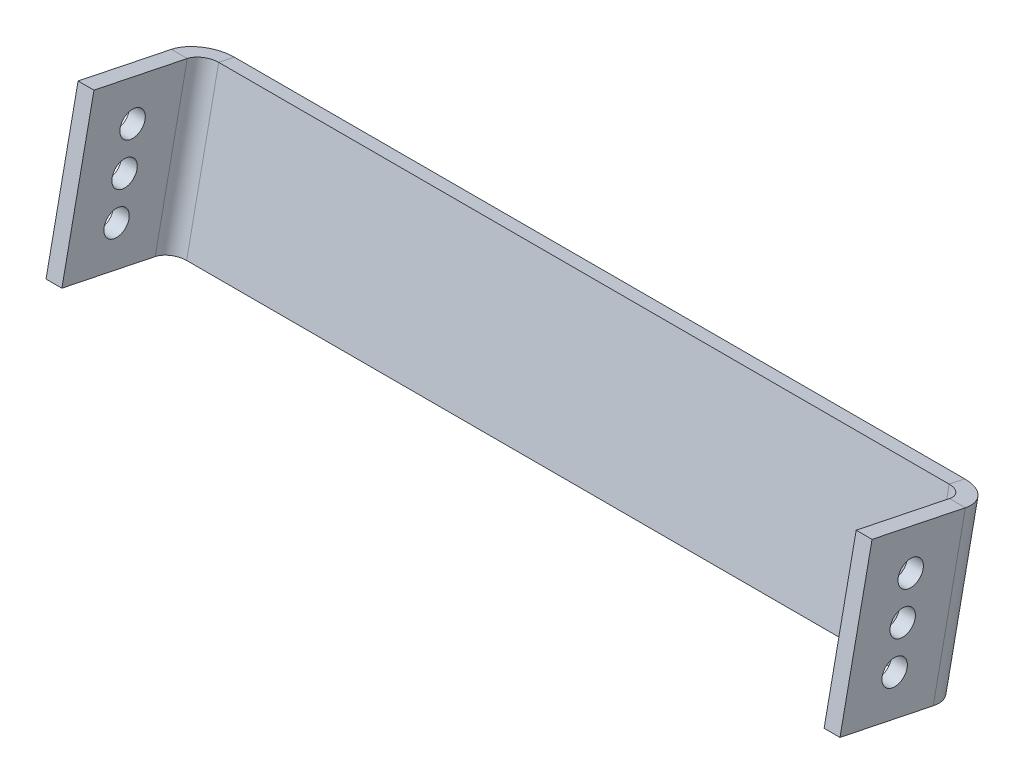
ISO-10303-21;
HEADER;
FILE_DESCRIPTION(('STEP AP214'),'2;1');
FILE_NAME('part.step','',(''),(''),'','','');
FILE_SCHEMA(('AUTOMOTIVE_DESIGN { 1 0 10303 214 1 1 1 1 }'));
ENDSEC;
DATA;
#1=APPLICATION_CONTEXT('core data for automotive mechanical design processes');
#2=APPLICATION_PROTOCOL_DEFINITION('international standard','automotive_design',2000,#1);
#3=PRODUCT_CONTEXT('',#1,'mechanical');
#4=PRODUCT('Part','Part','',(#3));
#5=PRODUCT_RELATED_PRODUCT_CATEGORY('part','',(#4));
#6=PRODUCT_DEFINITION_FORMATION('','',#4);
#7=PRODUCT_DEFINITION_CONTEXT('part definition',#1,'design');
#8=PRODUCT_DEFINITION('design','',#6,#7);
#9=PRODUCT_DEFINITION_SHAPE('','',#8);
#10=(LENGTH_UNIT() NAMED_UNIT(*) SI_UNIT(.MILLI.,.METRE.));
#11=(NAMED_UNIT(*) PLANE_ANGLE_UNIT() SI_UNIT($,.RADIAN.));
#12=(NAMED_UNIT(*) SI_UNIT($,.STERADIAN.) SOLID_ANGLE_UNIT());
#13=UNCERTAINTY_MEASURE_WITH_UNIT(LENGTH_MEASURE(1.E-05),#10,'distance_accuracy_value','');
#14=(GEOMETRIC_REPRESENTATION_CONTEXT(3) GLOBAL_UNCERTAINTY_ASSIGNED_CONTEXT((#13)) GLOBAL_UNIT_ASSIGNED_CONTEXT((#10,
#11,#12)) REPRESENTATION_CONTEXT('',''));
#15=CARTESIAN_POINT('',(0.,0.,0.));
#16=DIRECTION('',(0.,0.,1.));
#17=DIRECTION('',(1.,0.,0.));
#18=AXIS2_PLACEMENT_3D('',#15,#16,#17);
#19=CARTESIAN_POINT('',(158.75,97.3688534477811,-774.725032288376));
#20=DIRECTION('',(0.,0.201971637600388,0.979391371008045));
#21=DIRECTION('',(0.,-0.979391371008045,0.201971637600388));
#22=AXIS2_PLACEMENT_3D('',#19,#20,#21);
#23=PLANE('',#22);
#24=DIRECTION('',(0.,-0.979391371008045,0.201971637600388));
#25=VECTOR('',#24,1.);
#26=CARTESIAN_POINT('',(6.34999999999999,97.3688534477812,-774.725032288376));
#27=LINE('',#26,#25);
#28=CARTESIAN_POINT('',(6.34999999999999,97.3688534477812,-774.725032288376));
#29=VERTEX_POINT('',#28);
#30=CARTESIAN_POINT('',(6.34999999999998,128.464529477287,-781.137631782189));
#31=VERTEX_POINT('',#30);
#32=EDGE_CURVE('E215',#29,#31,#27,.F.);
#33=ORIENTED_EDGE('',*,*,#32,.T.);
#34=DIRECTION('',(-1.,0.,0.));
#35=VECTOR('',#34,1.);
#36=CARTESIAN_POINT('',(158.75,128.464529477287,-781.137631782189));
#37=LINE('',#36,#35);
#38=CARTESIAN_POINT('',(152.4,128.464529477287,-781.137631782189));
#39=VERTEX_POINT('',#38);
#40=EDGE_CURVE('E89',#39,#31,#37,.T.);
#41=ORIENTED_EDGE('',*,*,#40,.F.);
#42=DIRECTION('',(0.,0.979391371008045,-0.201971637600387));
#43=VECTOR('',#42,1.);
#44=CARTESIAN_POINT('',(152.4,128.464529477287,-781.137631782189));
#45=LINE('',#44,#43);
#46=CARTESIAN_POINT('',(152.4,97.3688534477811,-774.725032288376));
#47=VERTEX_POINT('',#46);
#48=EDGE_CURVE('E104',#39,#47,#45,.F.);
#49=ORIENTED_EDGE('',*,*,#48,.T.);
#50=DIRECTION('',(-1.,0.,0.));
#51=VECTOR('',#50,1.);
#52=CARTESIAN_POINT('',(158.75,97.3688534477811,-774.725032288376));
#53=LINE('',#52,#51);
#54=EDGE_CURVE('E13',#47,#29,#53,.T.);
#55=ORIENTED_EDGE('',*,*,#54,.T.);
#56=EDGE_LOOP('',(#33,#41,#49,#55));
#57=FACE_BOUND('',#56,.T.);
#58=ADVANCED_FACE('F80',(#57),#23,.F.);
#59=CARTESIAN_POINT('',(158.75,98.0101133971623,-771.615464685426));
#60=DIRECTION('',(0.,0.201971637600388,0.979391371008045));
#61=DIRECTION('',(0.,-0.979391371008045,0.201971637600388));
#62=AXIS2_PLACEMENT_3D('',#59,#60,#61);
#63=PLANE('',#62);
#64=DIRECTION('',(1.,0.,0.));
#65=VECTOR('',#64,1.);
#66=CARTESIAN_POINT('',(158.75,129.105789426668,-778.028064179238));
#67=LINE('',#66,#65);
#68=CARTESIAN_POINT('',(152.4,129.105789426668,-778.028064179238));
#69=VERTEX_POINT('',#68);
#70=CARTESIAN_POINT('',(6.34999999999998,129.105789426668,-778.028064179238));
#71=VERTEX_POINT('',#70);
#72=EDGE_CURVE('E286',#69,#71,#67,.F.);
#73=ORIENTED_EDGE('',*,*,#72,.T.);
#74=DIRECTION('',(0.,-0.979391371008045,0.201971637600388));
#75=VECTOR('',#74,1.);
#76=CARTESIAN_POINT('',(6.34999999999999,98.0101133971624,-771.615464685426));
#77=LINE('',#76,#75);
#78=CARTESIAN_POINT('',(6.34999999999999,98.0101133971624,-771.615464685426));
#79=VERTEX_POINT('',#78);
#80=EDGE_CURVE('E227',#79,#71,#77,.F.);
#81=ORIENTED_EDGE('',*,*,#80,.F.);
#82=DIRECTION('',(1.,0.,0.));
#83=VECTOR('',#82,1.);
#84=CARTESIAN_POINT('',(158.75,98.0101133971623,-771.615464685426));
#85=LINE('',#84,#83);
#86=CARTESIAN_POINT('',(152.4,98.0101133971623,-771.615464685426));
#87=VERTEX_POINT('',#86);
#88=EDGE_CURVE('E290',#87,#79,#85,.F.);
#89=ORIENTED_EDGE('',*,*,#88,.F.);
#90=DIRECTION('',(0.,0.979391371008045,-0.201971637600387));
#91=VECTOR('',#90,1.);
#92=CARTESIAN_POINT('',(152.4,129.105789426668,-778.028064179238));
#93=LINE('',#92,#91);
#94=EDGE_CURVE('E97',#69,#87,#93,.F.);
#95=ORIENTED_EDGE('',*,*,#94,.F.);
#96=EDGE_LOOP('',(#73,#81,#89,#95));
#97=FACE_BOUND('',#96,.T.);
#98=ADVANCED_FACE('F360',(#97),#63,.T.);
#99=CARTESIAN_POINT('',(158.75,97.3688534477811,-774.725032288376));
#100=DIRECTION('',(0.,0.979391371008045,-0.201971637600388));
#101=DIRECTION('',(-1.,0.,0.));
#102=AXIS2_PLACEMENT_3D('',#99,#100,#101);
#103=PLANE('',#102);
#104=ORIENTED_EDGE('',*,*,#88,.T.);
#105=DIRECTION('',(0.,-0.201971637600388,-0.979391371008045));
#106=VECTOR('',#105,1.);
#107=CARTESIAN_POINT('',(6.34999999999999,98.0101133971624,-771.615464685426));
#108=LINE('',#107,#106);
#109=EDGE_CURVE('E221',#79,#29,#108,.T.);
#110=ORIENTED_EDGE('',*,*,#109,.T.);
#111=ORIENTED_EDGE('',*,*,#54,.F.);
#112=DIRECTION('',(0.,-0.201971637600388,-0.979391371008045));
#113=VECTOR('',#112,1.);
#114=CARTESIAN_POINT('',(152.4,98.0101133971623,-771.615464685426));
#115=LINE('',#114,#113);
#116=EDGE_CURVE('E283',#87,#47,#115,.T.);
#117=ORIENTED_EDGE('',*,*,#116,.F.);
#118=EDGE_LOOP('',(#104,#110,#111,#117));
#119=FACE_BOUND('',#118,.T.);
#120=ADVANCED_FACE('F339',(#119),#103,.F.);
#121=CARTESIAN_POINT('',(158.75,128.464529477287,-781.137631782189));
#122=DIRECTION('',(0.,0.979391371008045,-0.201971637600388));
#123=DIRECTION('',(-1.,0.,0.));
#124=AXIS2_PLACEMENT_3D('',#121,#122,#123);
#125=PLANE('',#124);
#126=DIRECTION('',(0.,-0.201971637600387,-0.979391371008045));
#127=VECTOR('',#126,1.);
#128=CARTESIAN_POINT('',(6.34999999999998,129.105789426668,-778.028064179238));
#129=LINE('',#128,#127);
#130=EDGE_CURVE('E233',#71,#31,#129,.T.);
#131=ORIENTED_EDGE('',*,*,#130,.F.);
#132=ORIENTED_EDGE('',*,*,#72,.F.);
#133=DIRECTION('',(0.,-0.201971637600387,-0.979391371008045));
#134=VECTOR('',#133,1.);
#135=CARTESIAN_POINT('',(152.4,129.105789426668,-778.028064179238));
#136=LINE('',#135,#134);
#137=EDGE_CURVE('E274',#69,#39,#136,.T.);
#138=ORIENTED_EDGE('',*,*,#137,.T.);
#139=ORIENTED_EDGE('',*,*,#40,.T.);
#140=EDGE_LOOP('',(#131,#132,#138,#139));
#141=FACE_BOUND('',#140,.T.);
#142=ADVANCED_FACE('F82',(#141),#125,.T.);
#143=CARTESIAN_POINT('',(152.4,98.6513733465436,-768.505897082475));
#144=DIRECTION('',(0.,-0.979391371008045,0.201971637600387));
#145=DIRECTION('',(0.,-0.201971637600387,-0.979391371008045));
#146=AXIS2_PLACEMENT_3D('',#143,#144,#145);
#147=PLANE('',#146);
#148=DIRECTION('',(-1.,0.,0.));
#149=VECTOR('',#148,1.);
#150=CARTESIAN_POINT('',(158.75,98.6513733465436,-768.505897082475));
#151=LINE('',#150,#149);
#152=CARTESIAN_POINT('',(155.575,98.6513733465436,-768.505897082475));
#153=VERTEX_POINT('',#152);
#154=CARTESIAN_POINT('',(158.75,98.6513733465436,-768.505897082475));
#155=VERTEX_POINT('',#154);
#156=EDGE_CURVE('E236',#153,#155,#151,.F.);
#157=ORIENTED_EDGE('',*,*,#156,.F.);
#158=CARTESIAN_POINT('',(152.4,98.6513733465436,-768.505897082475));
#159=DIRECTION('',(0.,0.979391371008045,-0.201971637600387));
#160=DIRECTION('',(0.,0.201971637600387,0.979391371008045));
#161=AXIS2_PLACEMENT_3D('',#158,#159,#160);
#162=CIRCLE('',#161,3.17500000000001);
#163=EDGE_CURVE('E277',#87,#153,#162,.F.);
#164=ORIENTED_EDGE('',*,*,#163,.F.);
#165=ORIENTED_EDGE('',*,*,#116,.T.);
#166=CARTESIAN_POINT('',(152.4,98.6513733465436,-768.505897082475));
#167=DIRECTION('',(0.,0.979391371008045,-0.201971637600387));
#168=DIRECTION('',(0.,0.201971637600387,0.979391371008045));
#169=AXIS2_PLACEMENT_3D('',#166,#167,#168);
#170=CIRCLE('',#169,6.35000000000001);
#171=EDGE_CURVE('E270',#47,#155,#170,.F.);
#172=ORIENTED_EDGE('',*,*,#171,.T.);
#173=EDGE_LOOP('',(#157,#164,#165,#172));
#174=FACE_BOUND('',#173,.T.);
#175=ADVANCED_FACE('F373',(#174),#147,.T.);
#176=CARTESIAN_POINT('',(152.4,129.747049376049,-774.918496576287));
#177=DIRECTION('',(0.,-0.979391371008045,0.201971637600387));
#178=DIRECTION('',(0.,-0.201971637600387,-0.979391371008045));
#179=AXIS2_PLACEMENT_3D('',#176,#177,#178);
#180=PLANE('',#179);
#181=CARTESIAN_POINT('',(152.4,129.747049376049,-774.918496576287));
#182=DIRECTION('',(0.,0.979391371008045,-0.201971637600387));
#183=DIRECTION('',(0.,0.201971637600387,0.979391371008045));
#184=AXIS2_PLACEMENT_3D('',#181,#182,#183);
#185=CIRCLE('',#184,3.17500000000001);
#186=CARTESIAN_POINT('',(155.575,129.747049376049,-774.918496576287));
#187=VERTEX_POINT('',#186);
#188=EDGE_CURVE('E242',#187,#69,#185,.T.);
#189=ORIENTED_EDGE('',*,*,#188,.F.);
#190=DIRECTION('',(-1.,0.,0.));
#191=VECTOR('',#190,1.);
#192=CARTESIAN_POINT('',(155.575,129.747049376049,-774.918496576287));
#193=LINE('',#192,#191);
#194=CARTESIAN_POINT('',(158.75,129.747049376049,-774.918496576287));
#195=VERTEX_POINT('',#194);
#196=EDGE_CURVE('E262',#187,#195,#193,.F.);
#197=ORIENTED_EDGE('',*,*,#196,.T.);
#198=CARTESIAN_POINT('',(152.4,129.747049376049,-774.918496576287));
#199=DIRECTION('',(0.,0.979391371008045,-0.201971637600387));
#200=DIRECTION('',(0.,0.201971637600387,0.979391371008045));
#201=AXIS2_PLACEMENT_3D('',#198,#199,#200);
#202=CIRCLE('',#201,6.35000000000001);
#203=EDGE_CURVE('E271',#195,#39,#202,.T.);
#204=ORIENTED_EDGE('',*,*,#203,.T.);
#205=ORIENTED_EDGE('',*,*,#137,.F.);
#206=EDGE_LOOP('',(#189,#197,#204,#205));
#207=FACE_BOUND('',#206,.T.);
#208=ADVANCED_FACE('F367',(#207),#180,.F.);
#209=CARTESIAN_POINT('',(152.4,129.747049376049,-774.918496576287));
#210=DIRECTION('',(0.,0.979391371008045,-0.201971637600387));
#211=DIRECTION('',(1.,0.,0.));
#212=AXIS2_PLACEMENT_3D('',#209,#210,#211);
#213=CYLINDRICAL_SURFACE('',#212,6.35000000000001);
#214=ORIENTED_EDGE('',*,*,#48,.F.);
#215=ORIENTED_EDGE('',*,*,#203,.F.);
#216=DIRECTION('',(0.,0.979391371008045,-0.201971637600388));
#217=VECTOR('',#216,1.);
#218=CARTESIAN_POINT('',(158.75,98.6513733465436,-768.505897082475));
#219=LINE('',#218,#217);
#220=EDGE_CURVE('E260',#195,#155,#219,.F.);
#221=ORIENTED_EDGE('',*,*,#220,.T.);
#222=ORIENTED_EDGE('',*,*,#171,.F.);
#223=EDGE_LOOP('',(#214,#215,#221,#222));
#224=FACE_BOUND('',#223,.T.);
#225=ADVANCED_FACE('F381',(#224),#213,.T.);
#226=CARTESIAN_POINT('',(152.4,129.747049376049,-774.918496576287));
#227=DIRECTION('',(0.,0.979391371008045,-0.201971637600387));
#228=DIRECTION('',(1.,0.,0.));
#229=AXIS2_PLACEMENT_3D('',#226,#227,#228);
#230=CYLINDRICAL_SURFACE('',#229,3.17500000000001);
#231=ORIENTED_EDGE('',*,*,#94,.T.);
#232=ORIENTED_EDGE('',*,*,#163,.T.);
#233=DIRECTION('',(0.,0.979391371008045,-0.201971637600388));
#234=VECTOR('',#233,1.);
#235=CARTESIAN_POINT('',(155.575,98.6513733465436,-768.505897082475));
#236=LINE('',#235,#234);
#237=EDGE_CURVE('E265',#153,#187,#236,.T.);
#238=ORIENTED_EDGE('',*,*,#237,.T.);
#239=ORIENTED_EDGE('',*,*,#188,.T.);
#240=EDGE_LOOP('',(#231,#232,#238,#239));
#241=FACE_BOUND('',#240,.T.);
#242=ADVANCED_FACE('F384',(#241),#230,.F.);
#243=CARTESIAN_POINT('',(158.75,98.0101133971624,-771.615464685426));
#244=DIRECTION('',(0.,0.979391371008045,-0.201971637600388));
#245=DIRECTION('',(0.,0.201971637600388,0.979391371008045));
#246=AXIS2_PLACEMENT_3D('',#243,#244,#245);
#247=PLANE('',#246);
#248=ORIENTED_EDGE('',*,*,#156,.T.);
#249=DIRECTION('',(0.,-0.201971637600388,-0.979391371008045));
#250=VECTOR('',#249,1.);
#251=CARTESIAN_POINT('',(158.750000000003,246.644730467755,-50.8634664269166));
#252=LINE('',#251,#250);
#253=CARTESIAN_POINT('',(158.75,102.498933042831,-749.848491464772));
#254=VERTEX_POINT('',#253);
#255=EDGE_CURVE('E250',#254,#155,#252,.T.);
#256=ORIENTED_EDGE('',*,*,#255,.F.);
#257=DIRECTION('',(-1.,0.,0.));
#258=VECTOR('',#257,1.);
#259=CARTESIAN_POINT('',(158.75,102.498933042831,-749.848491464772));
#260=LINE('',#259,#258);
#261=CARTESIAN_POINT('',(155.575,102.498933042831,-749.848491464772));
#262=VERTEX_POINT('',#261);
#263=EDGE_CURVE('E243',#254,#262,#260,.T.);
#264=ORIENTED_EDGE('',*,*,#263,.T.);
#265=DIRECTION('',(0.,0.201971637600388,0.979391371008045));
#266=VECTOR('',#265,1.);
#267=CARTESIAN_POINT('',(155.575,98.0101133971624,-771.615464685426));
#268=LINE('',#267,#266);
#269=EDGE_CURVE('E257',#262,#153,#268,.F.);
#270=ORIENTED_EDGE('',*,*,#269,.T.);
#271=EDGE_LOOP('',(#248,#256,#264,#270));
#272=FACE_BOUND('',#271,.T.);
#273=ADVANCED_FACE('F387',(#272),#247,.F.);
#274=CARTESIAN_POINT('',(158.75,133.594609072336,-756.261090958584));
#275=DIRECTION('',(0.,-0.979391371008046,0.201971637600382));
#276=DIRECTION('',(0.,-0.201971637600383,-0.979391371008046));
#277=AXIS2_PLACEMENT_3D('',#274,#275,#276);
#278=PLANE('',#277);
#279=ORIENTED_EDGE('',*,*,#196,.F.);
#280=DIRECTION('',(0.,-0.201971637600383,-0.979391371008046));
#281=VECTOR('',#280,1.);
#282=CARTESIAN_POINT('',(155.575,133.594609072336,-756.261090958584));
#283=LINE('',#282,#281);
#284=CARTESIAN_POINT('',(155.575,133.594609072336,-756.261090958584));
#285=VERTEX_POINT('',#284);
#286=EDGE_CURVE('E255',#187,#285,#283,.F.);
#287=ORIENTED_EDGE('',*,*,#286,.T.);
#288=DIRECTION('',(-1.,0.,0.));
#289=VECTOR('',#288,1.);
#290=CARTESIAN_POINT('',(158.75,133.594609072336,-756.261090958584));
#291=LINE('',#290,#289);
#292=CARTESIAN_POINT('',(158.75,133.594609072336,-756.261090958584));
#293=VERTEX_POINT('',#292);
#294=EDGE_CURVE('E239',#293,#285,#291,.T.);
#295=ORIENTED_EDGE('',*,*,#294,.F.);
#296=DIRECTION('',(0.,0.201971637600383,0.979391371008046));
#297=VECTOR('',#296,1.);
#298=CARTESIAN_POINT('',(158.750000000003,277.740406497256,-57.2760659207264));
#299=LINE('',#298,#297);
#300=EDGE_CURVE('E248',#195,#293,#299,.T.);
#301=ORIENTED_EDGE('',*,*,#300,.F.);
#302=EDGE_LOOP('',(#279,#287,#295,#301));
#303=FACE_BOUND('',#302,.T.);
#304=ADVANCED_FACE('F394',(#303),#278,.F.);
#305=CARTESIAN_POINT('',(158.750000000003,-1.22364980379495E-13,-5.93366510868035E-13));
#306=DIRECTION('',(-1.,0.,0.));
#307=DIRECTION('',(0.,0.,1.));
#308=AXIS2_PLACEMENT_3D('',#305,#306,#307);
#309=PLANE('',#308);
#310=CARTESIAN_POINT('',(158.75,123.896910216816,-763.986643893983));
#311=DIRECTION('',(1.,0.,0.));
#312=DIRECTION('',(0.,0.,-1.));
#313=AXIS2_PLACEMENT_3D('',#310,#311,#312);
#314=CIRCLE('',#313,2.53999999999984);
#315=CARTESIAN_POINT('',(158.75,123.896910216816,-766.526643893983));
#316=VERTEX_POINT('',#315);
#317=EDGE_CURVE('E410',#316,#316,#314,.T.);
#318=ORIENTED_EDGE('',*,*,#317,.F.);
#319=EDGE_LOOP('',(#318));
#320=FACE_BOUND('',#319,.T.);
#321=CARTESIAN_POINT('',(158.75,108.349072202063,-760.780344147077));
#322=DIRECTION('',(1.,0.,0.));
#323=DIRECTION('',(0.,0.,-1.));
#324=AXIS2_PLACEMENT_3D('',#321,#322,#323);
#325=CIRCLE('',#324,2.53999999999992);
#326=CARTESIAN_POINT('',(158.75,108.349072202063,-763.320344147077));
#327=VERTEX_POINT('',#326);
#328=EDGE_CURVE('E308',#327,#327,#325,.T.);
#329=ORIENTED_EDGE('',*,*,#328,.F.);
#330=EDGE_LOOP('',(#329));
#331=FACE_BOUND('',#330,.T.);
#332=CARTESIAN_POINT('',(158.75,116.12299120944,-762.38349402053));
#333=DIRECTION('',(1.,0.,0.));
#334=DIRECTION('',(0.,0.,-1.));
#335=AXIS2_PLACEMENT_3D('',#332,#333,#334);
#336=CIRCLE('',#335,2.53999999999986);
#337=CARTESIAN_POINT('',(158.75,116.12299120944,-764.92349402053));
#338=VERTEX_POINT('',#337);
#339=EDGE_CURVE('E305',#338,#338,#336,.T.);
#340=ORIENTED_EDGE('',*,*,#339,.F.);
#341=EDGE_LOOP('',(#340));
#342=FACE_BOUND('',#341,.T.);
#343=ORIENTED_EDGE('',*,*,#220,.F.);
#344=ORIENTED_EDGE('',*,*,#300,.T.);
#345=DIRECTION('',(0.,-0.979391371008045,0.201971637600388));
#346=VECTOR('',#345,1.);
#347=CARTESIAN_POINT('',(158.75,-144.145797424924,-698.985025037856));
#348=LINE('',#347,#346);
#349=EDGE_CURVE('E246',#293,#254,#348,.T.);
#350=ORIENTED_EDGE('',*,*,#349,.T.);
#351=ORIENTED_EDGE('',*,*,#255,.T.);
#352=EDGE_LOOP('',(#343,#344,#350,#351));
#353=FACE_BOUND('',#352,.T.);
#354=ADVANCED_FACE('F397',(#320,#331,#342,#353),#309,.F.);
#355=CARTESIAN_POINT('',(155.575000000003,-1.20125122706359E-13,-5.82505098328044E-13));
#356=DIRECTION('',(-1.,0.,0.));
#357=DIRECTION('',(0.,0.,1.));
#358=AXIS2_PLACEMENT_3D('',#355,#356,#357);
#359=PLANE('',#358);
#360=CARTESIAN_POINT('',(155.575,123.896910216816,-763.986643893983));
#361=DIRECTION('',(-1.,0.,0.));
#362=DIRECTION('',(0.,0.,1.));
#363=AXIS2_PLACEMENT_3D('',#360,#361,#362);
#364=CIRCLE('',#363,2.53999999999984);
#365=CARTESIAN_POINT('',(155.575,123.896910216816,-761.446643893983));
#366=VERTEX_POINT('',#365);
#367=EDGE_CURVE('E313',#366,#366,#364,.T.);
#368=ORIENTED_EDGE('',*,*,#367,.F.);
#369=EDGE_LOOP('',(#368));
#370=FACE_BOUND('',#369,.T.);
#371=CARTESIAN_POINT('',(155.575,108.349072202063,-760.780344147077));
#372=DIRECTION('',(-1.,0.,0.));
#373=DIRECTION('',(0.,0.,1.));
#374=AXIS2_PLACEMENT_3D('',#371,#372,#373);
#375=CIRCLE('',#374,2.53999999999992);
#376=CARTESIAN_POINT('',(155.575,108.349072202063,-758.240344147077));
#377=VERTEX_POINT('',#376);
#378=EDGE_CURVE('E300',#377,#377,#375,.T.);
#379=ORIENTED_EDGE('',*,*,#378,.F.);
#380=EDGE_LOOP('',(#379));
#381=FACE_BOUND('',#380,.T.);
#382=CARTESIAN_POINT('',(155.575,116.12299120944,-762.38349402053));
#383=DIRECTION('',(-1.,0.,0.));
#384=DIRECTION('',(0.,0.,1.));
#385=AXIS2_PLACEMENT_3D('',#382,#383,#384);
#386=CIRCLE('',#385,2.53999999999986);
#387=CARTESIAN_POINT('',(155.575,116.12299120944,-759.84349402053));
#388=VERTEX_POINT('',#387);
#389=EDGE_CURVE('E214',#388,#388,#386,.T.);
#390=ORIENTED_EDGE('',*,*,#389,.F.);
#391=EDGE_LOOP('',(#390));
#392=FACE_BOUND('',#391,.T.);
#393=ORIENTED_EDGE('',*,*,#286,.F.);
#394=ORIENTED_EDGE('',*,*,#237,.F.);
#395=ORIENTED_EDGE('',*,*,#269,.F.);
#396=DIRECTION('',(0.,0.979391371008045,-0.201971637600388));
#397=VECTOR('',#396,1.);
#398=CARTESIAN_POINT('',(155.575,102.498933042831,-749.848491464772));
#399=LINE('',#398,#397);
#400=EDGE_CURVE('E253',#285,#262,#399,.F.);
#401=ORIENTED_EDGE('',*,*,#400,.F.);
#402=EDGE_LOOP('',(#393,#394,#395,#401));
#403=FACE_BOUND('',#402,.T.);
#404=ADVANCED_FACE('F355',(#370,#381,#392,#403),#359,.T.);
#405=CARTESIAN_POINT('',(158.75,102.498933042831,-749.848491464772));
#406=DIRECTION('',(0.,-0.201971637600388,-0.979391371008045));
#407=DIRECTION('',(0.,0.979391371008045,-0.201971637600388));
#408=AXIS2_PLACEMENT_3D('',#405,#406,#407);
#409=PLANE('',#408);
#410=ORIENTED_EDGE('',*,*,#400,.T.);
#411=ORIENTED_EDGE('',*,*,#263,.F.);
#412=ORIENTED_EDGE('',*,*,#349,.F.);
#413=ORIENTED_EDGE('',*,*,#294,.T.);
#414=EDGE_LOOP('',(#410,#411,#412,#413));
#415=FACE_BOUND('',#414,.T.);
#416=ADVANCED_FACE('F348',(#415),#409,.F.);
#417=CARTESIAN_POINT('',(6.34999999999999,129.747049376049,-774.918496576287));
#418=DIRECTION('',(0.,0.979391371008045,-0.201971637600388));
#419=DIRECTION('',(0.,0.201971637600388,0.979391371008045));
#420=AXIS2_PLACEMENT_3D('',#417,#418,#419);
#421=PLANE('',#420);
#422=DIRECTION('',(1.,0.,0.));
#423=VECTOR('',#422,1.);
#424=CARTESIAN_POINT('',(0.,129.747049376049,-774.918496576287));
#425=LINE('',#424,#423);
#426=CARTESIAN_POINT('',(3.17499999999999,129.747049376049,-774.918496576287));
#427=VERTEX_POINT('',#426);
#428=CARTESIAN_POINT('',(0.,129.747049376049,-774.918496576287));
#429=VERTEX_POINT('',#428);
#430=EDGE_CURVE('E196',#427,#429,#425,.F.);
#431=ORIENTED_EDGE('',*,*,#430,.F.);
#432=CARTESIAN_POINT('',(6.34999999999999,129.747049376049,-774.918496576287));
#433=DIRECTION('',(0.,-0.979391371008045,0.201971637600388));
#434=DIRECTION('',(0.,-0.201971637600388,-0.979391371008045));
#435=AXIS2_PLACEMENT_3D('',#432,#433,#434);
#436=CIRCLE('',#435,3.175);
#437=EDGE_CURVE('E224',#71,#427,#436,.F.);
#438=ORIENTED_EDGE('',*,*,#437,.F.);
#439=ORIENTED_EDGE('',*,*,#130,.T.);
#440=CARTESIAN_POINT('',(6.34999999999999,129.747049376049,-774.918496576287));
#441=DIRECTION('',(0.,-0.979391371008045,0.201971637600388));
#442=DIRECTION('',(0.,-0.201971637600388,-0.979391371008045));
#443=AXIS2_PLACEMENT_3D('',#440,#441,#442);
#444=CIRCLE('',#443,6.35);
#445=EDGE_CURVE('E217',#31,#429,#444,.F.);
#446=ORIENTED_EDGE('',*,*,#445,.T.);
#447=EDGE_LOOP('',(#431,#438,#439,#446));
#448=FACE_BOUND('',#447,.T.);
#449=ADVANCED_FACE('F346',(#448),#421,.T.);
#450=CARTESIAN_POINT('',(6.34999999999999,98.6513733465436,-768.505897082475));
#451=DIRECTION('',(0.,0.979391371008045,-0.201971637600388));
#452=DIRECTION('',(0.,0.201971637600388,0.979391371008045));
#453=AXIS2_PLACEMENT_3D('',#450,#451,#452);
#454=PLANE('',#453);
#455=CARTESIAN_POINT('',(6.34999999999999,98.6513733465436,-768.505897082475));
#456=DIRECTION('',(0.,-0.979391371008045,0.201971637600388));
#457=DIRECTION('',(0.,-0.201971637600388,-0.979391371008045));
#458=AXIS2_PLACEMENT_3D('',#455,#456,#457);
#459=CIRCLE('',#458,3.175);
#460=CARTESIAN_POINT('',(3.17499999999999,98.6513733465436,-768.505897082475));
#461=VERTEX_POINT('',#460);
#462=EDGE_CURVE('E230',#461,#79,#459,.T.);
#463=ORIENTED_EDGE('',*,*,#462,.F.);
#464=DIRECTION('',(1.,0.,0.));
#465=VECTOR('',#464,1.);
#466=CARTESIAN_POINT('',(3.17499999999999,98.6513733465436,-768.505897082475));
#467=LINE('',#466,#465);
#468=CARTESIAN_POINT('',(0.,98.6513733465436,-768.505897082475));
#469=VERTEX_POINT('',#468);
#470=EDGE_CURVE('E208',#461,#469,#467,.F.);
#471=ORIENTED_EDGE('',*,*,#470,.T.);
#472=CARTESIAN_POINT('',(6.34999999999999,98.6513733465436,-768.505897082475));
#473=DIRECTION('',(0.,-0.979391371008045,0.201971637600388));
#474=DIRECTION('',(0.,-0.201971637600388,-0.979391371008045));
#475=AXIS2_PLACEMENT_3D('',#472,#473,#474);
#476=CIRCLE('',#475,6.35);
#477=EDGE_CURVE('E218',#469,#29,#476,.T.);
#478=ORIENTED_EDGE('',*,*,#477,.T.);
#479=ORIENTED_EDGE('',*,*,#109,.F.);
#480=EDGE_LOOP('',(#463,#471,#478,#479));
#481=FACE_BOUND('',#480,.T.);
#482=ADVANCED_FACE('F336',(#481),#454,.F.);
#483=CARTESIAN_POINT('',(6.34999999999999,98.6513733465436,-768.505897082475));
#484=DIRECTION('',(0.,-0.979391371008045,0.201971637600388));
#485=DIRECTION('',(-1.,0.,0.));
#486=AXIS2_PLACEMENT_3D('',#483,#484,#485);
#487=CYLINDRICAL_SURFACE('',#486,6.35);
#488=ORIENTED_EDGE('',*,*,#32,.F.);
#489=ORIENTED_EDGE('',*,*,#477,.F.);
#490=DIRECTION('',(0.,-0.979391371008045,0.201971637600388));
#491=VECTOR('',#490,1.);
#492=CARTESIAN_POINT('',(0.,129.747049376049,-774.918496576287));
#493=LINE('',#492,#491);
#494=EDGE_CURVE('E206',#469,#429,#493,.F.);
#495=ORIENTED_EDGE('',*,*,#494,.T.);
#496=ORIENTED_EDGE('',*,*,#445,.F.);
#497=EDGE_LOOP('',(#488,#489,#495,#496));
#498=FACE_BOUND('',#497,.T.);
#499=ADVANCED_FACE('F342',(#498),#487,.T.);
#500=CARTESIAN_POINT('',(6.34999999999999,98.6513733465436,-768.505897082475));
#501=DIRECTION('',(0.,-0.979391371008045,0.201971637600388));
#502=DIRECTION('',(-1.,0.,0.));
#503=AXIS2_PLACEMENT_3D('',#500,#501,#502);
#504=CYLINDRICAL_SURFACE('',#503,3.175);
#505=ORIENTED_EDGE('',*,*,#80,.T.);
#506=ORIENTED_EDGE('',*,*,#437,.T.);
#507=DIRECTION('',(0.,-0.979391371008045,0.201971637600388));
#508=VECTOR('',#507,1.);
#509=CARTESIAN_POINT('',(3.17499999999999,129.747049376049,-774.918496576287));
#510=LINE('',#509,#508);
#511=EDGE_CURVE('E211',#427,#461,#510,.T.);
#512=ORIENTED_EDGE('',*,*,#511,.T.);
#513=ORIENTED_EDGE('',*,*,#462,.T.);
#514=EDGE_LOOP('',(#505,#506,#512,#513));
#515=FACE_BOUND('',#514,.T.);
#516=ADVANCED_FACE('F332',(#515),#504,.F.);
#517=CARTESIAN_POINT('',(0.,102.498933042831,-749.848491464772));
#518=DIRECTION('',(0.,0.979391371008044,-0.201971637600391));
#519=DIRECTION('',(0.,0.201971637600391,0.979391371008044));
#520=AXIS2_PLACEMENT_3D('',#517,#518,#519);
#521=PLANE('',#520);
#522=ORIENTED_EDGE('',*,*,#470,.F.);
#523=DIRECTION('',(0.,-0.201971637600391,-0.979391371008044));
#524=VECTOR('',#523,1.);
#525=CARTESIAN_POINT('',(3.17499999999992,102.498933042831,-749.848491464772));
#526=LINE('',#525,#524);
#527=CARTESIAN_POINT('',(3.17499999999992,102.498933042831,-749.848491464772));
#528=VERTEX_POINT('',#527);
#529=EDGE_CURVE('E204',#461,#528,#526,.F.);
#530=ORIENTED_EDGE('',*,*,#529,.T.);
#531=DIRECTION('',(1.,0.,0.));
#532=VECTOR('',#531,1.);
#533=CARTESIAN_POINT('',(0.,102.498933042831,-749.848491464772));
#534=LINE('',#533,#532);
#535=CARTESIAN_POINT('',(0.,102.498933042831,-749.848491464772));
#536=VERTEX_POINT('',#535);
#537=EDGE_CURVE('E192',#536,#528,#534,.T.);
#538=ORIENTED_EDGE('',*,*,#537,.F.);
#539=DIRECTION('',(0.,0.201971637600391,0.979391371008044));
#540=VECTOR('',#539,1.);
#541=CARTESIAN_POINT('',(-2.57042651052863E-12,246.644730467757,-50.863466426917));
#542=LINE('',#541,#540);
#543=EDGE_CURVE('E179',#469,#536,#542,.T.);
#544=ORIENTED_EDGE('',*,*,#543,.F.);
#545=EDGE_LOOP('',(#522,#530,#538,#544));
#546=FACE_BOUND('',#545,.T.);
#547=ADVANCED_FACE('F325',(#546),#521,.F.);
#548=CARTESIAN_POINT('',(0.,129.105789426668,-778.028064179238));
#549=DIRECTION('',(0.,-0.979391371008045,0.201971637600387));
#550=DIRECTION('',(0.,-0.201971637600387,-0.979391371008045));
#551=AXIS2_PLACEMENT_3D('',#548,#549,#550);
#552=PLANE('',#551);
#553=ORIENTED_EDGE('',*,*,#430,.T.);
#554=DIRECTION('',(0.,-0.201971637600387,-0.979391371008045));
#555=VECTOR('',#554,1.);
#556=CARTESIAN_POINT('',(-2.57042651052863E-12,277.74040649726,-57.2760659207279));
#557=LINE('',#556,#555);
#558=CARTESIAN_POINT('',(0.,133.594609072337,-756.261090958584));
#559=VERTEX_POINT('',#558);
#560=EDGE_CURVE('E177',#559,#429,#557,.T.);
#561=ORIENTED_EDGE('',*,*,#560,.F.);
#562=DIRECTION('',(1.,0.,0.));
#563=VECTOR('',#562,1.);
#564=CARTESIAN_POINT('',(0.,133.594609072337,-756.261090958584));
#565=LINE('',#564,#563);
#566=CARTESIAN_POINT('',(3.17499999999992,133.594609072337,-756.261090958584));
#567=VERTEX_POINT('',#566);
#568=EDGE_CURVE('E185',#559,#567,#565,.T.);
#569=ORIENTED_EDGE('',*,*,#568,.T.);
#570=DIRECTION('',(0.,0.201971637600387,0.979391371008045));
#571=VECTOR('',#570,1.);
#572=CARTESIAN_POINT('',(3.175,129.105789426668,-778.028064179238));
#573=LINE('',#572,#571);
#574=EDGE_CURVE('E201',#567,#427,#573,.F.);
#575=ORIENTED_EDGE('',*,*,#574,.T.);
#576=EDGE_LOOP('',(#553,#561,#569,#575));
#577=FACE_BOUND('',#576,.T.);
#578=ADVANCED_FACE('F195',(#577),#552,.F.);
#579=CARTESIAN_POINT('',(-2.57042651052863E-12,0.,0.));
#580=DIRECTION('',(1.,0.,0.));
#581=DIRECTION('',(0.,0.,-1.));
#582=AXIS2_PLACEMENT_3D('',#579,#580,#581);
#583=PLANE('',#582);
#584=CARTESIAN_POINT('',(-1.38777878078145E-13,123.896910216816,-763.986643893982));
#585=DIRECTION('',(1.,0.,0.));
#586=DIRECTION('',(0.,0.,-1.));
#587=AXIS2_PLACEMENT_3D('',#584,#585,#586);
#588=CIRCLE('',#587,2.53999999999984);
#589=CARTESIAN_POINT('',(-1.48097959651393E-13,123.896910216816,-766.526643893982));
#590=VERTEX_POINT('',#589);
#591=EDGE_CURVE('E687',#590,#590,#588,.T.);
#592=ORIENTED_EDGE('',*,*,#591,.T.);
#593=EDGE_LOOP('',(#592));
#594=FACE_BOUND('',#593,.T.);
#595=CARTESIAN_POINT('',(-1.38777878078145E-13,108.349072202063,-760.780344147076));
#596=DIRECTION('',(1.,0.,0.));
#597=DIRECTION('',(0.,0.,-1.));
#598=AXIS2_PLACEMENT_3D('',#595,#596,#597);
#599=CIRCLE('',#598,2.53999999999992);
#600=CARTESIAN_POINT('',(-1.48097959651393E-13,108.349072202063,-763.320344147076));
#601=VERTEX_POINT('',#600);
#602=EDGE_CURVE('E301',#601,#601,#599,.T.);
#603=ORIENTED_EDGE('',*,*,#602,.T.);
#604=EDGE_LOOP('',(#603));
#605=FACE_BOUND('',#604,.T.);
#606=CARTESIAN_POINT('',(-1.38777878078145E-13,116.12299120944,-762.383494020529));
#607=DIRECTION('',(1.,0.,0.));
#608=DIRECTION('',(0.,0.,-1.));
#609=AXIS2_PLACEMENT_3D('',#606,#607,#608);
#610=CIRCLE('',#609,2.53999999999986);
#611=CARTESIAN_POINT('',(-1.48097959651393E-13,116.12299120944,-764.923494020529));
#612=VERTEX_POINT('',#611);
#613=EDGE_CURVE('E297',#612,#612,#610,.T.);
#614=ORIENTED_EDGE('',*,*,#613,.T.);
#615=EDGE_LOOP('',(#614));
#616=FACE_BOUND('',#615,.T.);
#617=ORIENTED_EDGE('',*,*,#494,.F.);
#618=ORIENTED_EDGE('',*,*,#543,.T.);
#619=DIRECTION('',(0.,0.979391371008045,-0.201971637600388));
#620=VECTOR('',#619,1.);
#621=CARTESIAN_POINT('',(0.,-144.145797424924,-698.985025037856));
#622=LINE('',#621,#620);
#623=EDGE_CURVE('E172',#536,#559,#622,.T.);
#624=ORIENTED_EDGE('',*,*,#623,.T.);
#625=ORIENTED_EDGE('',*,*,#560,.T.);
#626=EDGE_LOOP('',(#617,#618,#624,#625));
#627=FACE_BOUND('',#626,.T.);
#628=ADVANCED_FACE('F175',(#594,#605,#616,#627),#583,.F.);
#629=CARTESIAN_POINT('',(3.17499999999743,0.,0.));
#630=DIRECTION('',(1.,0.,0.));
#631=DIRECTION('',(0.,0.,-1.));
#632=AXIS2_PLACEMENT_3D('',#629,#630,#631);
#633=PLANE('',#632);
#634=CARTESIAN_POINT('',(3.17499999999996,123.896910216816,-763.986643893982));
#635=DIRECTION('',(1.,0.,0.));
#636=DIRECTION('',(0.,0.,-1.));
#637=AXIS2_PLACEMENT_3D('',#634,#635,#636);
#638=CIRCLE('',#637,2.53999999999984);
#639=CARTESIAN_POINT('',(3.17499999999996,123.896910216816,-766.526643893982));
#640=VERTEX_POINT('',#639);
#641=EDGE_CURVE('E84',#640,#640,#638,.T.);
#642=ORIENTED_EDGE('',*,*,#641,.F.);
#643=EDGE_LOOP('',(#642));
#644=FACE_BOUND('',#643,.T.);
#645=CARTESIAN_POINT('',(3.17499999999996,108.349072202063,-760.780344147076));
#646=DIRECTION('',(1.,0.,0.));
#647=DIRECTION('',(0.,0.,-1.));
#648=AXIS2_PLACEMENT_3D('',#645,#646,#647);
#649=CIRCLE('',#648,2.53999999999992);
#650=CARTESIAN_POINT('',(3.17499999999996,108.349072202063,-763.320344147076));
#651=VERTEX_POINT('',#650);
#652=EDGE_CURVE('E298',#651,#651,#649,.T.);
#653=ORIENTED_EDGE('',*,*,#652,.F.);
#654=EDGE_LOOP('',(#653));
#655=FACE_BOUND('',#654,.T.);
#656=CARTESIAN_POINT('',(3.17499999999996,116.12299120944,-762.383494020529));
#657=DIRECTION('',(1.,0.,0.));
#658=DIRECTION('',(0.,0.,-1.));
#659=AXIS2_PLACEMENT_3D('',#656,#657,#658);
#660=CIRCLE('',#659,2.53999999999986);
#661=CARTESIAN_POINT('',(3.17499999999996,116.12299120944,-764.923494020529));
#662=VERTEX_POINT('',#661);
#663=EDGE_CURVE('E295',#662,#662,#660,.T.);
#664=ORIENTED_EDGE('',*,*,#663,.F.);
#665=EDGE_LOOP('',(#664));
#666=FACE_BOUND('',#665,.T.);
#667=ORIENTED_EDGE('',*,*,#529,.F.);
#668=ORIENTED_EDGE('',*,*,#511,.F.);
#669=ORIENTED_EDGE('',*,*,#574,.F.);
#670=DIRECTION('',(0.,-0.979391371008045,0.201971637600388));
#671=VECTOR('',#670,1.);
#672=CARTESIAN_POINT('',(3.17499999999992,133.594609072337,-756.261090958584));
#673=LINE('',#672,#671);
#674=EDGE_CURVE('E188',#528,#567,#673,.F.);
#675=ORIENTED_EDGE('',*,*,#674,.F.);
#676=EDGE_LOOP('',(#667,#668,#669,#675));
#677=FACE_BOUND('',#676,.T.);
#678=ADVANCED_FACE('F329',(#644,#655,#666,#677),#633,.T.);
#679=CARTESIAN_POINT('',(0.,133.594609072337,-756.261090958584));
#680=DIRECTION('',(0.,-0.201971637600388,-0.979391371008045));
#681=DIRECTION('',(0.,0.979391371008045,-0.201971637600388));
#682=AXIS2_PLACEMENT_3D('',#679,#680,#681);
#683=PLANE('',#682);
#684=ORIENTED_EDGE('',*,*,#674,.T.);
#685=ORIENTED_EDGE('',*,*,#568,.F.);
#686=ORIENTED_EDGE('',*,*,#623,.F.);
#687=ORIENTED_EDGE('',*,*,#537,.T.);
#688=EDGE_LOOP('',(#684,#685,#686,#687));
#689=FACE_BOUND('',#688,.T.);
#690=ADVANCED_FACE('F186',(#689),#683,.F.);
#691=CARTESIAN_POINT('',(-1.38777878078145E-13,116.12299120944,-762.383494020529));
#692=DIRECTION('',(1.,0.,0.));
#693=DIRECTION('',(0.,0.,-1.));
#694=AXIS2_PLACEMENT_3D('',#691,#692,#693);
#695=CYLINDRICAL_SURFACE('',#694,2.53999999999986);
#696=ORIENTED_EDGE('',*,*,#663,.T.);
#697=EDGE_LOOP('',(#696));
#698=FACE_BOUND('',#697,.T.);
#699=ORIENTED_EDGE('',*,*,#613,.F.);
#700=EDGE_LOOP('',(#699));
#701=FACE_BOUND('',#700,.T.);
#702=ADVANCED_FACE('F434',(#698,#701),#695,.F.);
#703=ORIENTED_EDGE('',*,*,#389,.T.);
#704=EDGE_LOOP('',(#703));
#705=FACE_BOUND('',#704,.T.);
#706=ORIENTED_EDGE('',*,*,#339,.T.);
#707=EDGE_LOOP('',(#706));
#708=FACE_BOUND('',#707,.T.);
#709=ADVANCED_FACE('F431',(#705,#708),#695,.F.);
#710=CARTESIAN_POINT('',(-1.38777878078145E-13,108.349072202063,-760.780344147076));
#711=DIRECTION('',(1.,0.,0.));
#712=DIRECTION('',(0.,0.,-1.));
#713=AXIS2_PLACEMENT_3D('',#710,#711,#712);
#714=CYLINDRICAL_SURFACE('',#713,2.53999999999992);
#715=ORIENTED_EDGE('',*,*,#652,.T.);
#716=EDGE_LOOP('',(#715));
#717=FACE_BOUND('',#716,.T.);
#718=ORIENTED_EDGE('',*,*,#602,.F.);
#719=EDGE_LOOP('',(#718));
#720=FACE_BOUND('',#719,.T.);
#721=ADVANCED_FACE('F433',(#717,#720),#714,.F.);
#722=ORIENTED_EDGE('',*,*,#378,.T.);
#723=EDGE_LOOP('',(#722));
#724=FACE_BOUND('',#723,.T.);
#725=ORIENTED_EDGE('',*,*,#328,.T.);
#726=EDGE_LOOP('',(#725));
#727=FACE_BOUND('',#726,.T.);
#728=ADVANCED_FACE('F441',(#724,#727),#714,.F.);
#729=CARTESIAN_POINT('',(-1.38777878078145E-13,123.896910216816,-763.986643893982));
#730=DIRECTION('',(1.,0.,0.));
#731=DIRECTION('',(0.,0.,-1.));
#732=AXIS2_PLACEMENT_3D('',#729,#730,#731);
#733=CYLINDRICAL_SURFACE('',#732,2.53999999999984);
#734=ORIENTED_EDGE('',*,*,#641,.T.);
#735=EDGE_LOOP('',(#734));
#736=FACE_BOUND('',#735,.T.);
#737=ORIENTED_EDGE('',*,*,#591,.F.);
#738=EDGE_LOOP('',(#737));
#739=FACE_BOUND('',#738,.T.);
#740=ADVANCED_FACE('F511',(#736,#739),#733,.F.);
#741=ORIENTED_EDGE('',*,*,#367,.T.);
#742=EDGE_LOOP('',(#741));
#743=FACE_BOUND('',#742,.T.);
#744=ORIENTED_EDGE('',*,*,#317,.T.);
#745=EDGE_LOOP('',(#744));
#746=FACE_BOUND('',#745,.T.);
#747=ADVANCED_FACE('F521',(#743,#746),#733,.F.);
#748=CLOSED_SHELL('',(#58,#98,#120,#142,#175,#208,#225,#242,#273,#304,#354,#404,#416,#449,#482,
#499,#516,#547,#578,#628,#678,#690,#702,#709,#721,#728,#740,#747));
#749=MANIFOLD_SOLID_BREP('B2',#748);
#750=ADVANCED_BREP_SHAPE_REPRESENTATION('',(#18,#749),#14);
#751=SHAPE_DEFINITION_REPRESENTATION(#9,#750);
ENDSEC;
END-ISO-10303-21;
